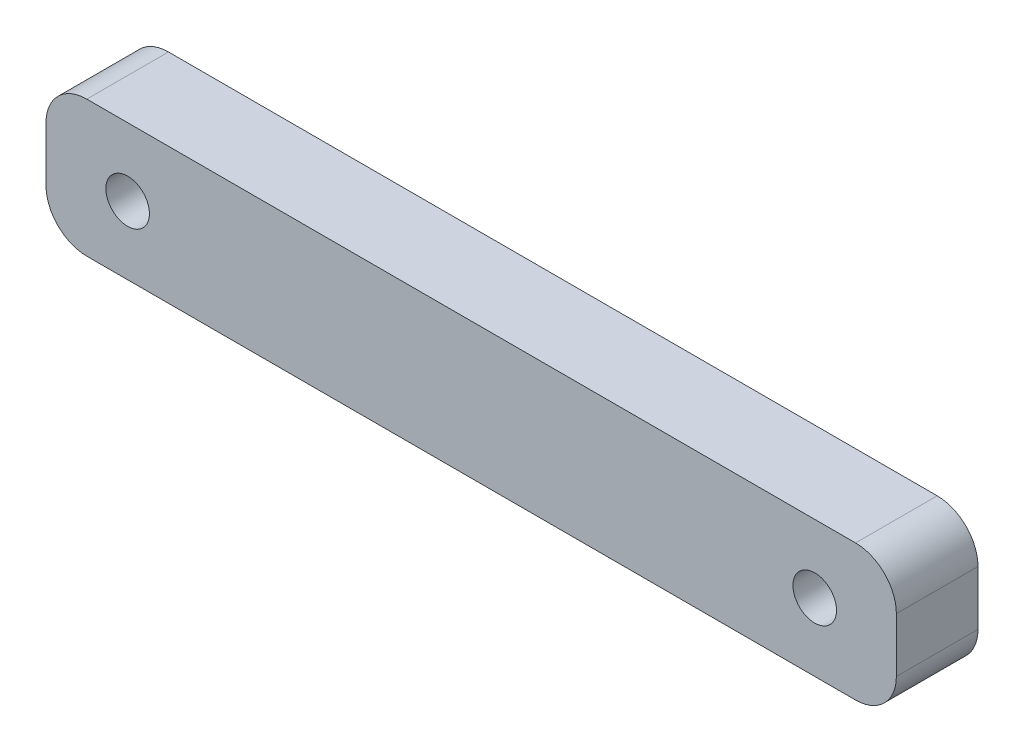
ISO-10303-21;
HEADER;
FILE_DESCRIPTION(('STEP AP214'),'2;1');
FILE_NAME('part.step','',(''),(''),'','','');
FILE_SCHEMA(('AUTOMOTIVE_DESIGN { 1 0 10303 214 1 1 1 1 }'));
ENDSEC;
DATA;
#1=APPLICATION_CONTEXT('core data for automotive mechanical design processes');
#2=APPLICATION_PROTOCOL_DEFINITION('international standard','automotive_design',2000,#1);
#3=PRODUCT_CONTEXT('',#1,'mechanical');
#4=PRODUCT('Part','Part','',(#3));
#5=PRODUCT_RELATED_PRODUCT_CATEGORY('part','',(#4));
#6=PRODUCT_DEFINITION_FORMATION('','',#4);
#7=PRODUCT_DEFINITION_CONTEXT('part definition',#1,'design');
#8=PRODUCT_DEFINITION('design','',#6,#7);
#9=PRODUCT_DEFINITION_SHAPE('','',#8);
#10=(LENGTH_UNIT() NAMED_UNIT(*) SI_UNIT(.MILLI.,.METRE.));
#11=(NAMED_UNIT(*) PLANE_ANGLE_UNIT() SI_UNIT($,.RADIAN.));
#12=(NAMED_UNIT(*) SI_UNIT($,.STERADIAN.) SOLID_ANGLE_UNIT());
#13=UNCERTAINTY_MEASURE_WITH_UNIT(LENGTH_MEASURE(1.E-05),#10,'distance_accuracy_value','');
#14=(GEOMETRIC_REPRESENTATION_CONTEXT(3) GLOBAL_UNCERTAINTY_ASSIGNED_CONTEXT((#13)) GLOBAL_UNIT_ASSIGNED_CONTEXT((#10,
#11,#12)) REPRESENTATION_CONTEXT('',''));
#15=CARTESIAN_POINT('',(0.,0.,0.));
#16=DIRECTION('',(0.,0.,1.));
#17=DIRECTION('',(1.,0.,0.));
#18=AXIS2_PLACEMENT_3D('',#15,#16,#17);
#19=CARTESIAN_POINT('',(0.,0.,6.));
#20=DIRECTION('',(1.,0.,0.));
#21=DIRECTION('',(0.,0.,-1.));
#22=AXIS2_PLACEMENT_3D('',#19,#20,#21);
#23=PLANE('',#22);
#24=DIRECTION('',(0.,-1.,0.));
#25=VECTOR('',#24,1.);
#26=CARTESIAN_POINT('',(0.,0.,0.));
#27=LINE('',#26,#25);
#28=CARTESIAN_POINT('',(0.,-3.,0.));
#29=VERTEX_POINT('',#28);
#30=CARTESIAN_POINT('',(0.,-7.,0.));
#31=VERTEX_POINT('',#30);
#32=EDGE_CURVE('E129',#29,#31,#27,.T.);
#33=ORIENTED_EDGE('',*,*,#32,.T.);
#34=DIRECTION('',(0.,0.,-1.));
#35=VECTOR('',#34,1.);
#36=CARTESIAN_POINT('',(0.,-7.,6.));
#37=LINE('',#36,#35);
#38=CARTESIAN_POINT('',(0.,-7.,6.));
#39=VERTEX_POINT('',#38);
#40=EDGE_CURVE('E11',#31,#39,#37,.F.);
#41=ORIENTED_EDGE('',*,*,#40,.T.);
#42=DIRECTION('',(0.,-1.,0.));
#43=VECTOR('',#42,1.);
#44=CARTESIAN_POINT('',(0.,0.,6.));
#45=LINE('',#44,#43);
#46=CARTESIAN_POINT('',(0.,-3.,6.));
#47=VERTEX_POINT('',#46);
#48=EDGE_CURVE('E127',#47,#39,#45,.T.);
#49=ORIENTED_EDGE('',*,*,#48,.F.);
#50=DIRECTION('',(0.,0.,-1.));
#51=VECTOR('',#50,1.);
#52=CARTESIAN_POINT('',(0.,-3.,6.));
#53=LINE('',#52,#51);
#54=EDGE_CURVE('E41',#47,#29,#53,.T.);
#55=ORIENTED_EDGE('',*,*,#54,.T.);
#56=EDGE_LOOP('',(#33,#41,#49,#55));
#57=FACE_BOUND('',#56,.T.);
#58=ADVANCED_FACE('F33',(#57),#23,.F.);
#59=CARTESIAN_POINT('',(0.,-10.,6.));
#60=DIRECTION('',(0.,1.,0.));
#61=DIRECTION('',(0.,0.,1.));
#62=AXIS2_PLACEMENT_3D('',#59,#60,#61);
#63=PLANE('',#62);
#64=DIRECTION('',(1.,0.,0.));
#65=VECTOR('',#64,1.);
#66=CARTESIAN_POINT('',(0.,-10.,0.));
#67=LINE('',#66,#65);
#68=CARTESIAN_POINT('',(3.,-10.,0.));
#69=VERTEX_POINT('',#68);
#70=CARTESIAN_POINT('',(59.5,-10.,0.));
#71=VERTEX_POINT('',#70);
#72=EDGE_CURVE('E125',#69,#71,#67,.T.);
#73=ORIENTED_EDGE('',*,*,#72,.T.);
#74=DIRECTION('',(0.,0.,-1.));
#75=VECTOR('',#74,1.);
#76=CARTESIAN_POINT('',(59.5,-10.,6.));
#77=LINE('',#76,#75);
#78=CARTESIAN_POINT('',(59.5,-10.,6.));
#79=VERTEX_POINT('',#78);
#80=EDGE_CURVE('E104',#71,#79,#77,.F.);
#81=ORIENTED_EDGE('',*,*,#80,.T.);
#82=DIRECTION('',(1.,0.,0.));
#83=VECTOR('',#82,1.);
#84=CARTESIAN_POINT('',(0.,-10.,6.));
#85=LINE('',#84,#83);
#86=CARTESIAN_POINT('',(3.,-10.,6.));
#87=VERTEX_POINT('',#86);
#88=EDGE_CURVE('E169',#87,#79,#85,.T.);
#89=ORIENTED_EDGE('',*,*,#88,.F.);
#90=DIRECTION('',(0.,0.,-1.));
#91=VECTOR('',#90,1.);
#92=CARTESIAN_POINT('',(3.,-10.,6.));
#93=LINE('',#92,#91);
#94=EDGE_CURVE('E109',#87,#69,#93,.T.);
#95=ORIENTED_EDGE('',*,*,#94,.T.);
#96=EDGE_LOOP('',(#73,#81,#89,#95));
#97=FACE_BOUND('',#96,.T.);
#98=ADVANCED_FACE('F201',(#97),#63,.F.);
#99=CARTESIAN_POINT('',(62.5,0.,6.));
#100=DIRECTION('',(-1.,0.,0.));
#101=DIRECTION('',(0.,0.,1.));
#102=AXIS2_PLACEMENT_3D('',#99,#100,#101);
#103=PLANE('',#102);
#104=DIRECTION('',(0.,1.,0.));
#105=VECTOR('',#104,1.);
#106=CARTESIAN_POINT('',(62.5,0.,6.));
#107=LINE('',#106,#105);
#108=CARTESIAN_POINT('',(62.5,-7.,6.));
#109=VERTEX_POINT('',#108);
#110=CARTESIAN_POINT('',(62.5,-3.,6.));
#111=VERTEX_POINT('',#110);
#112=EDGE_CURVE('E118',#109,#111,#107,.T.);
#113=ORIENTED_EDGE('',*,*,#112,.F.);
#114=DIRECTION('',(0.,0.,-1.));
#115=VECTOR('',#114,1.);
#116=CARTESIAN_POINT('',(62.5,-7.,6.));
#117=LINE('',#116,#115);
#118=CARTESIAN_POINT('',(62.5,-7.,0.));
#119=VERTEX_POINT('',#118);
#120=EDGE_CURVE('E103',#109,#119,#117,.T.);
#121=ORIENTED_EDGE('',*,*,#120,.T.);
#122=DIRECTION('',(0.,1.,0.));
#123=VECTOR('',#122,1.);
#124=CARTESIAN_POINT('',(62.5,0.,0.));
#125=LINE('',#124,#123);
#126=CARTESIAN_POINT('',(62.5,-3.,0.));
#127=VERTEX_POINT('',#126);
#128=EDGE_CURVE('E116',#119,#127,#125,.T.);
#129=ORIENTED_EDGE('',*,*,#128,.T.);
#130=DIRECTION('',(0.,0.,-1.));
#131=VECTOR('',#130,1.);
#132=CARTESIAN_POINT('',(62.5,-3.,6.));
#133=LINE('',#132,#131);
#134=EDGE_CURVE('E120',#127,#111,#133,.F.);
#135=ORIENTED_EDGE('',*,*,#134,.T.);
#136=EDGE_LOOP('',(#113,#121,#129,#135));
#137=FACE_BOUND('',#136,.T.);
#138=ADVANCED_FACE('F115',(#137),#103,.F.);
#139=CARTESIAN_POINT('',(0.,0.,6.));
#140=DIRECTION('',(0.,-1.,0.));
#141=DIRECTION('',(0.,0.,-1.));
#142=AXIS2_PLACEMENT_3D('',#139,#140,#141);
#143=PLANE('',#142);
#144=DIRECTION('',(-1.,0.,0.));
#145=VECTOR('',#144,1.);
#146=CARTESIAN_POINT('',(0.,0.,6.));
#147=LINE('',#146,#145);
#148=CARTESIAN_POINT('',(59.5,0.,6.));
#149=VERTEX_POINT('',#148);
#150=CARTESIAN_POINT('',(3.,0.,6.));
#151=VERTEX_POINT('',#150);
#152=EDGE_CURVE('E133',#149,#151,#147,.T.);
#153=ORIENTED_EDGE('',*,*,#152,.F.);
#154=DIRECTION('',(0.,0.,-1.));
#155=VECTOR('',#154,1.);
#156=CARTESIAN_POINT('',(59.5,0.,6.));
#157=LINE('',#156,#155);
#158=CARTESIAN_POINT('',(59.5,0.,0.));
#159=VERTEX_POINT('',#158);
#160=EDGE_CURVE('E150',#149,#159,#157,.T.);
#161=ORIENTED_EDGE('',*,*,#160,.T.);
#162=DIRECTION('',(-1.,0.,0.));
#163=VECTOR('',#162,1.);
#164=CARTESIAN_POINT('',(0.,0.,0.));
#165=LINE('',#164,#163);
#166=CARTESIAN_POINT('',(3.,0.,0.));
#167=VERTEX_POINT('',#166);
#168=EDGE_CURVE('E124',#159,#167,#165,.T.);
#169=ORIENTED_EDGE('',*,*,#168,.T.);
#170=DIRECTION('',(0.,0.,-1.));
#171=VECTOR('',#170,1.);
#172=CARTESIAN_POINT('',(3.,0.,6.));
#173=LINE('',#172,#171);
#174=EDGE_CURVE('E48',#167,#151,#173,.F.);
#175=ORIENTED_EDGE('',*,*,#174,.T.);
#176=EDGE_LOOP('',(#153,#161,#169,#175));
#177=FACE_BOUND('',#176,.T.);
#178=ADVANCED_FACE('F194',(#177),#143,.F.);
#179=CARTESIAN_POINT('',(0.,0.,6.));
#180=DIRECTION('',(0.,0.,1.));
#181=DIRECTION('',(1.,0.,0.));
#182=AXIS2_PLACEMENT_3D('',#179,#180,#181);
#183=PLANE('',#182);
#184=CARTESIAN_POINT('',(6.,-5.,6.));
#185=DIRECTION('',(0.,0.,1.));
#186=DIRECTION('',(1.,0.,0.));
#187=AXIS2_PLACEMENT_3D('',#184,#185,#186);
#188=CIRCLE('',#187,1.6);
#189=CARTESIAN_POINT('',(7.6,-5.,6.));
#190=VERTEX_POINT('',#189);
#191=EDGE_CURVE('E176',#190,#190,#188,.T.);
#192=ORIENTED_EDGE('',*,*,#191,.F.);
#193=EDGE_LOOP('',(#192));
#194=FACE_BOUND('',#193,.T.);
#195=CARTESIAN_POINT('',(56.5,-5.,6.));
#196=DIRECTION('',(0.,0.,1.));
#197=DIRECTION('',(1.,0.,0.));
#198=AXIS2_PLACEMENT_3D('',#195,#196,#197);
#199=CIRCLE('',#198,1.6);
#200=CARTESIAN_POINT('',(58.1,-5.,6.));
#201=VERTEX_POINT('',#200);
#202=EDGE_CURVE('E164',#201,#201,#199,.T.);
#203=ORIENTED_EDGE('',*,*,#202,.F.);
#204=EDGE_LOOP('',(#203));
#205=FACE_BOUND('',#204,.T.);
#206=ORIENTED_EDGE('',*,*,#88,.T.);
#207=CARTESIAN_POINT('',(59.5,-7.,6.));
#208=DIRECTION('',(0.,0.,1.));
#209=DIRECTION('',(1.,0.,0.));
#210=AXIS2_PLACEMENT_3D('',#207,#208,#209);
#211=CIRCLE('',#210,3.);
#212=EDGE_CURVE('E147',#79,#109,#211,.T.);
#213=ORIENTED_EDGE('',*,*,#212,.T.);
#214=ORIENTED_EDGE('',*,*,#112,.T.);
#215=CARTESIAN_POINT('',(59.5,-3.,6.));
#216=DIRECTION('',(0.,0.,1.));
#217=DIRECTION('',(1.,0.,0.));
#218=AXIS2_PLACEMENT_3D('',#215,#216,#217);
#219=CIRCLE('',#218,3.);
#220=EDGE_CURVE('E55',#111,#149,#219,.T.);
#221=ORIENTED_EDGE('',*,*,#220,.T.);
#222=ORIENTED_EDGE('',*,*,#152,.T.);
#223=CARTESIAN_POINT('',(3.,-3.,6.));
#224=DIRECTION('',(0.,0.,1.));
#225=DIRECTION('',(1.,0.,0.));
#226=AXIS2_PLACEMENT_3D('',#223,#224,#225);
#227=CIRCLE('',#226,3.);
#228=EDGE_CURVE('E142',#151,#47,#227,.T.);
#229=ORIENTED_EDGE('',*,*,#228,.T.);
#230=ORIENTED_EDGE('',*,*,#48,.T.);
#231=CARTESIAN_POINT('',(3.,-7.,6.));
#232=DIRECTION('',(0.,0.,1.));
#233=DIRECTION('',(1.,0.,0.));
#234=AXIS2_PLACEMENT_3D('',#231,#232,#233);
#235=CIRCLE('',#234,3.);
#236=EDGE_CURVE('E144',#39,#87,#235,.T.);
#237=ORIENTED_EDGE('',*,*,#236,.T.);
#238=EDGE_LOOP('',(#206,#213,#214,#221,#222,#229,#230,#237));
#239=FACE_BOUND('',#238,.T.);
#240=ADVANCED_FACE('F191',(#194,#205,#239),#183,.T.);
#241=CARTESIAN_POINT('',(0.,0.,0.));
#242=DIRECTION('',(0.,0.,1.));
#243=DIRECTION('',(1.,0.,0.));
#244=AXIS2_PLACEMENT_3D('',#241,#242,#243);
#245=PLANE('',#244);
#246=CARTESIAN_POINT('',(6.,-5.,0.));
#247=DIRECTION('',(0.,0.,1.));
#248=DIRECTION('',(1.,0.,0.));
#249=AXIS2_PLACEMENT_3D('',#246,#247,#248);
#250=CIRCLE('',#249,1.6);
#251=CARTESIAN_POINT('',(7.6,-5.,0.));
#252=VERTEX_POINT('',#251);
#253=EDGE_CURVE('E174',#252,#252,#250,.T.);
#254=ORIENTED_EDGE('',*,*,#253,.T.);
#255=EDGE_LOOP('',(#254));
#256=FACE_BOUND('',#255,.T.);
#257=CARTESIAN_POINT('',(56.5,-5.,0.));
#258=DIRECTION('',(0.,0.,1.));
#259=DIRECTION('',(1.,0.,0.));
#260=AXIS2_PLACEMENT_3D('',#257,#258,#259);
#261=CIRCLE('',#260,1.6);
#262=CARTESIAN_POINT('',(58.1,-5.,0.));
#263=VERTEX_POINT('',#262);
#264=EDGE_CURVE('E162',#263,#263,#261,.T.);
#265=ORIENTED_EDGE('',*,*,#264,.T.);
#266=EDGE_LOOP('',(#265));
#267=FACE_BOUND('',#266,.T.);
#268=ORIENTED_EDGE('',*,*,#128,.F.);
#269=CARTESIAN_POINT('',(59.5,-7.,0.));
#270=DIRECTION('',(0.,0.,1.));
#271=DIRECTION('',(1.,0.,0.));
#272=AXIS2_PLACEMENT_3D('',#269,#270,#271);
#273=CIRCLE('',#272,3.);
#274=EDGE_CURVE('E99',#119,#71,#273,.F.);
#275=ORIENTED_EDGE('',*,*,#274,.T.);
#276=ORIENTED_EDGE('',*,*,#72,.F.);
#277=CARTESIAN_POINT('',(3.,-7.,0.));
#278=DIRECTION('',(0.,0.,1.));
#279=DIRECTION('',(1.,0.,0.));
#280=AXIS2_PLACEMENT_3D('',#277,#278,#279);
#281=CIRCLE('',#280,3.);
#282=EDGE_CURVE('E136',#69,#31,#281,.F.);
#283=ORIENTED_EDGE('',*,*,#282,.T.);
#284=ORIENTED_EDGE('',*,*,#32,.F.);
#285=CARTESIAN_POINT('',(3.,-3.,0.));
#286=DIRECTION('',(0.,0.,1.));
#287=DIRECTION('',(1.,0.,0.));
#288=AXIS2_PLACEMENT_3D('',#285,#286,#287);
#289=CIRCLE('',#288,3.);
#290=EDGE_CURVE('E119',#29,#167,#289,.F.);
#291=ORIENTED_EDGE('',*,*,#290,.T.);
#292=ORIENTED_EDGE('',*,*,#168,.F.);
#293=CARTESIAN_POINT('',(59.5,-3.,0.));
#294=DIRECTION('',(0.,0.,1.));
#295=DIRECTION('',(1.,0.,0.));
#296=AXIS2_PLACEMENT_3D('',#293,#294,#295);
#297=CIRCLE('',#296,3.);
#298=EDGE_CURVE('E110',#159,#127,#297,.F.);
#299=ORIENTED_EDGE('',*,*,#298,.T.);
#300=EDGE_LOOP('',(#268,#275,#276,#283,#284,#291,#292,#299));
#301=FACE_BOUND('',#300,.T.);
#302=ADVANCED_FACE('F122',(#256,#267,#301),#245,.F.);
#303=CARTESIAN_POINT('',(56.5,-5.,0.));
#304=DIRECTION('',(0.,0.,1.));
#305=DIRECTION('',(1.,0.,0.));
#306=AXIS2_PLACEMENT_3D('',#303,#304,#305);
#307=CYLINDRICAL_SURFACE('',#306,1.6);
#308=ORIENTED_EDGE('',*,*,#264,.F.);
#309=EDGE_LOOP('',(#308));
#310=FACE_BOUND('',#309,.T.);
#311=ORIENTED_EDGE('',*,*,#202,.T.);
#312=EDGE_LOOP('',(#311));
#313=FACE_BOUND('',#312,.T.);
#314=ADVANCED_FACE('F187',(#310,#313),#307,.F.);
#315=CARTESIAN_POINT('',(6.,-5.,0.));
#316=DIRECTION('',(0.,0.,1.));
#317=DIRECTION('',(1.,0.,0.));
#318=AXIS2_PLACEMENT_3D('',#315,#316,#317);
#319=CYLINDRICAL_SURFACE('',#318,1.6);
#320=ORIENTED_EDGE('',*,*,#253,.F.);
#321=EDGE_LOOP('',(#320));
#322=FACE_BOUND('',#321,.T.);
#323=ORIENTED_EDGE('',*,*,#191,.T.);
#324=EDGE_LOOP('',(#323));
#325=FACE_BOUND('',#324,.T.);
#326=ADVANCED_FACE('F184',(#322,#325),#319,.F.);
#327=CARTESIAN_POINT('',(59.5,-7.,6.));
#328=DIRECTION('',(0.,0.,-1.));
#329=DIRECTION('',(-1.,0.,0.));
#330=AXIS2_PLACEMENT_3D('',#327,#328,#329);
#331=CYLINDRICAL_SURFACE('',#330,3.);
#332=ORIENTED_EDGE('',*,*,#212,.F.);
#333=ORIENTED_EDGE('',*,*,#80,.F.);
#334=ORIENTED_EDGE('',*,*,#274,.F.);
#335=ORIENTED_EDGE('',*,*,#120,.F.);
#336=EDGE_LOOP('',(#332,#333,#334,#335));
#337=FACE_BOUND('',#336,.T.);
#338=ADVANCED_FACE('F102',(#337),#331,.T.);
#339=CARTESIAN_POINT('',(59.5,-3.,6.));
#340=DIRECTION('',(0.,0.,-1.));
#341=DIRECTION('',(-1.,0.,0.));
#342=AXIS2_PLACEMENT_3D('',#339,#340,#341);
#343=CYLINDRICAL_SURFACE('',#342,3.);
#344=ORIENTED_EDGE('',*,*,#220,.F.);
#345=ORIENTED_EDGE('',*,*,#134,.F.);
#346=ORIENTED_EDGE('',*,*,#298,.F.);
#347=ORIENTED_EDGE('',*,*,#160,.F.);
#348=EDGE_LOOP('',(#344,#345,#346,#347));
#349=FACE_BOUND('',#348,.T.);
#350=ADVANCED_FACE('F208',(#349),#343,.T.);
#351=CARTESIAN_POINT('',(3.,-7.,6.));
#352=DIRECTION('',(0.,0.,-1.));
#353=DIRECTION('',(-1.,0.,0.));
#354=AXIS2_PLACEMENT_3D('',#351,#352,#353);
#355=CYLINDRICAL_SURFACE('',#354,3.);
#356=ORIENTED_EDGE('',*,*,#236,.F.);
#357=ORIENTED_EDGE('',*,*,#40,.F.);
#358=ORIENTED_EDGE('',*,*,#282,.F.);
#359=ORIENTED_EDGE('',*,*,#94,.F.);
#360=EDGE_LOOP('',(#356,#357,#358,#359));
#361=FACE_BOUND('',#360,.T.);
#362=ADVANCED_FACE('F203',(#361),#355,.T.);
#363=CARTESIAN_POINT('',(3.,-3.,6.));
#364=DIRECTION('',(0.,0.,-1.));
#365=DIRECTION('',(-1.,0.,0.));
#366=AXIS2_PLACEMENT_3D('',#363,#364,#365);
#367=CYLINDRICAL_SURFACE('',#366,3.);
#368=ORIENTED_EDGE('',*,*,#228,.F.);
#369=ORIENTED_EDGE('',*,*,#174,.F.);
#370=ORIENTED_EDGE('',*,*,#290,.F.);
#371=ORIENTED_EDGE('',*,*,#54,.F.);
#372=EDGE_LOOP('',(#368,#369,#370,#371));
#373=FACE_BOUND('',#372,.T.);
#374=ADVANCED_FACE('F35',(#373),#367,.T.);
#375=CLOSED_SHELL('',(#58,#98,#138,#178,#240,#302,#314,#326,#338,#350,#362,#374));
#376=MANIFOLD_SOLID_BREP('B2',#375);
#377=ADVANCED_BREP_SHAPE_REPRESENTATION('',(#18,#376),#14);
#378=SHAPE_DEFINITION_REPRESENTATION(#9,#377);
ENDSEC;
END-ISO-10303-21;
